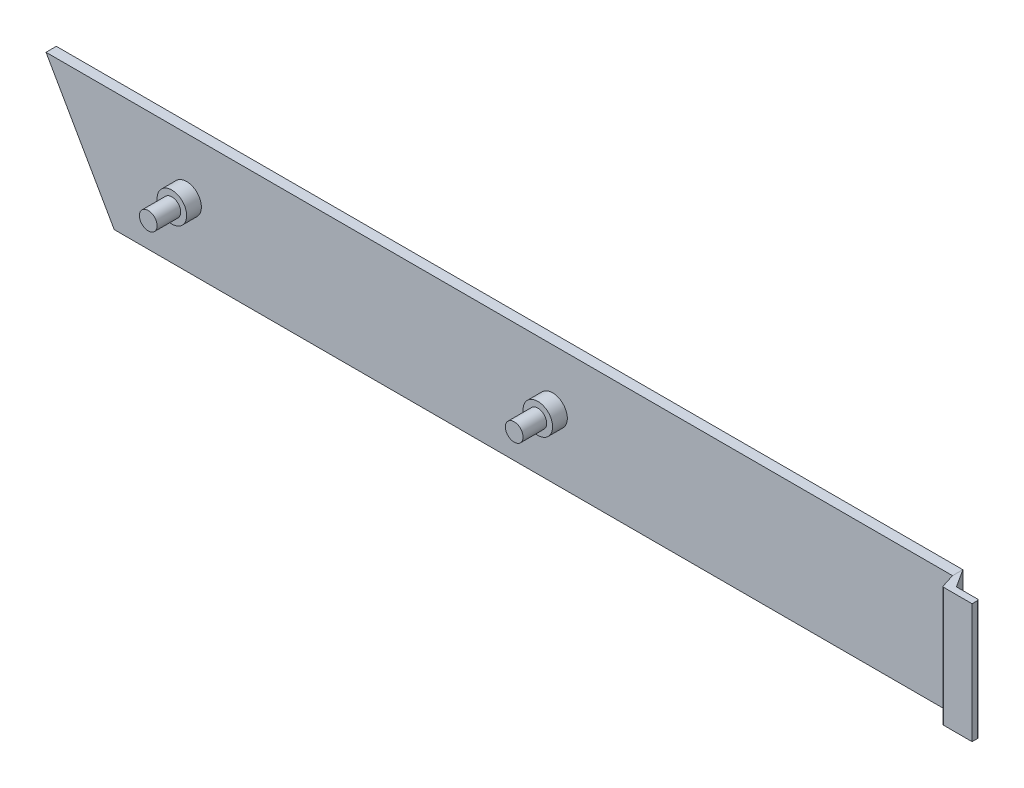
ISO-10303-21;
HEADER;
FILE_DESCRIPTION(('STEP AP214'),'2;1');
FILE_NAME('part.step','',(''),(''),'','','');
FILE_SCHEMA(('AUTOMOTIVE_DESIGN { 1 0 10303 214 1 1 1 1 }'));
ENDSEC;
DATA;
#1=APPLICATION_CONTEXT('core data for automotive mechanical design processes');
#2=APPLICATION_PROTOCOL_DEFINITION('international standard','automotive_design',2000,#1);
#3=PRODUCT_CONTEXT('',#1,'mechanical');
#4=PRODUCT('Part','Part','',(#3));
#5=PRODUCT_RELATED_PRODUCT_CATEGORY('part','',(#4));
#6=PRODUCT_DEFINITION_FORMATION('','',#4);
#7=PRODUCT_DEFINITION_CONTEXT('part definition',#1,'design');
#8=PRODUCT_DEFINITION('design','',#6,#7);
#9=PRODUCT_DEFINITION_SHAPE('','',#8);
#10=(LENGTH_UNIT() NAMED_UNIT(*) SI_UNIT(.MILLI.,.METRE.));
#11=(NAMED_UNIT(*) PLANE_ANGLE_UNIT() SI_UNIT($,.RADIAN.));
#12=(NAMED_UNIT(*) SI_UNIT($,.STERADIAN.) SOLID_ANGLE_UNIT());
#13=UNCERTAINTY_MEASURE_WITH_UNIT(LENGTH_MEASURE(1.E-05),#10,'distance_accuracy_value','');
#14=(GEOMETRIC_REPRESENTATION_CONTEXT(3) GLOBAL_UNCERTAINTY_ASSIGNED_CONTEXT((#13)) GLOBAL_UNIT_ASSIGNED_CONTEXT((#10,
#11,#12)) REPRESENTATION_CONTEXT('',''));
#15=CARTESIAN_POINT('',(0.,0.,0.));
#16=DIRECTION('',(0.,0.,1.));
#17=DIRECTION('',(1.,0.,0.));
#18=AXIS2_PLACEMENT_3D('',#15,#16,#17);
#19=CARTESIAN_POINT('',(0.,0.,0.));
#20=DIRECTION('',(0.,1.,0.));
#21=DIRECTION('',(0.,0.,1.));
#22=AXIS2_PLACEMENT_3D('',#19,#20,#21);
#23=PLANE('',#22);
#24=DIRECTION('',(-1.,0.,0.));
#25=VECTOR('',#24,1.);
#26=CARTESIAN_POINT('',(147.04430838964,0.,6.12592708642393));
#27=LINE('',#26,#25);
#28=CARTESIAN_POINT('',(146.54430838964,0.,6.12592708642393));
#29=VERTEX_POINT('',#28);
#30=CARTESIAN_POINT('',(139.715688943178,0.,6.12592708642393));
#31=VERTEX_POINT('',#30);
#32=EDGE_CURVE('E159',#29,#31,#27,.T.);
#33=ORIENTED_EDGE('',*,*,#32,.F.);
#34=CARTESIAN_POINT('',(146.54430838964,0.,6.62592708642393));
#35=DIRECTION('',(0.,1.,0.));
#36=DIRECTION('',(0.,0.,1.));
#37=AXIS2_PLACEMENT_3D('',#34,#35,#36);
#38=CIRCLE('',#37,0.5);
#39=CARTESIAN_POINT('',(147.04430838964,0.,6.62592708642393));
#40=VERTEX_POINT('',#39);
#41=EDGE_CURVE('E175',#29,#40,#38,.F.);
#42=ORIENTED_EDGE('',*,*,#41,.T.);
#43=DIRECTION('',(0.,0.,-1.));
#44=VECTOR('',#43,1.);
#45=CARTESIAN_POINT('',(147.04430838964,0.,8.42851835154063));
#46=LINE('',#45,#44);
#47=CARTESIAN_POINT('',(147.04430838964,0.,8.42851835154063));
#48=VERTEX_POINT('',#47);
#49=EDGE_CURVE('E156',#48,#40,#46,.T.);
#50=ORIENTED_EDGE('',*,*,#49,.F.);
#51=DIRECTION('',(1.,0.,0.));
#52=VECTOR('',#51,1.);
#53=CARTESIAN_POINT('',(137.04430838964,0.,8.42851835154063));
#54=LINE('',#53,#52);
#55=CARTESIAN_POINT('',(137.411704059277,0.,8.42851835154063));
#56=VERTEX_POINT('',#55);
#57=EDGE_CURVE('E144',#56,#48,#54,.T.);
#58=ORIENTED_EDGE('',*,*,#57,.F.);
#59=CARTESIAN_POINT('',(137.411704059277,0.,7.92851835154063));
#60=DIRECTION('',(0.,1.,0.));
#61=DIRECTION('',(0.,0.,1.));
#62=AXIS2_PLACEMENT_3D('',#59,#60,#61);
#63=CIRCLE('',#62,0.5);
#64=CARTESIAN_POINT('',(136.934541515382,0.,8.07790344686134));
#65=VERTEX_POINT('',#64);
#66=EDGE_CURVE('E143',#56,#65,#63,.F.);
#67=ORIENTED_EDGE('',*,*,#66,.T.);
#68=DIRECTION('',(0.298770190641397,0.,0.954325087789325));
#69=VECTOR('',#68,1.);
#70=CARTESIAN_POINT('',(135.501339032227,0.,3.5));
#71=LINE('',#70,#69);
#72=CARTESIAN_POINT('',(135.501339032227,0.,3.5));
#73=VERTEX_POINT('',#72);
#74=EDGE_CURVE('E127',#73,#65,#71,.T.);
#75=ORIENTED_EDGE('',*,*,#74,.F.);
#76=DIRECTION('',(0.,0.,1.));
#77=VECTOR('',#76,1.);
#78=CARTESIAN_POINT('',(135.501339032227,0.,3.5));
#79=LINE('',#78,#77);
#80=CARTESIAN_POINT('',(135.501339032227,0.,0.));
#81=VERTEX_POINT('',#80);
#82=EDGE_CURVE('E141',#81,#73,#79,.T.);
#83=ORIENTED_EDGE('',*,*,#82,.F.);
#84=DIRECTION('',(-0.541088390934601,0.,-0.840965726528617));
#85=VECTOR('',#84,1.);
#86=CARTESIAN_POINT('',(135.501339032227,0.,0.));
#87=LINE('',#86,#85);
#88=CARTESIAN_POINT('',(139.295206079914,0.,5.89647128189124));
#89=VERTEX_POINT('',#88);
#90=EDGE_CURVE('E162',#89,#81,#87,.T.);
#91=ORIENTED_EDGE('',*,*,#90,.F.);
#92=CARTESIAN_POINT('',(139.715688943178,0.,5.62592708642393));
#93=DIRECTION('',(0.,1.,0.));
#94=DIRECTION('',(0.,0.,1.));
#95=AXIS2_PLACEMENT_3D('',#92,#93,#94);
#96=CIRCLE('',#95,0.5);
#97=EDGE_CURVE('E61',#89,#31,#96,.T.);
#98=ORIENTED_EDGE('',*,*,#97,.T.);
#99=EDGE_LOOP('',(#33,#42,#50,#58,#67,#75,#83,#91,#98));
#100=FACE_BOUND('',#99,.T.);
#101=ADVANCED_FACE('F53',(#100),#23,.F.);
#102=CARTESIAN_POINT('',(135.501339032227,54.7722137401885,0.));
#103=DIRECTION('',(-0.840965726528617,0.,0.541088390934601));
#104=DIRECTION('',(0.541088390934601,0.,0.840965726528617));
#105=AXIS2_PLACEMENT_3D('',#102,#103,#104);
#106=PLANE('',#105);
#107=DIRECTION('',(0.541088390934601,0.,0.840965726528617));
#108=VECTOR('',#107,1.);
#109=CARTESIAN_POINT('',(135.501339032227,40.4795560731052,0.));
#110=LINE('',#109,#108);
#111=CARTESIAN_POINT('',(135.501339032227,40.4795560731052,0.));
#112=VERTEX_POINT('',#111);
#113=CARTESIAN_POINT('',(139.295206079914,40.4795560731052,5.89647128189124));
#114=VERTEX_POINT('',#113);
#115=EDGE_CURVE('E134',#112,#114,#110,.T.);
#116=ORIENTED_EDGE('',*,*,#115,.T.);
#117=DIRECTION('',(0.,-1.,0.));
#118=VECTOR('',#117,1.);
#119=CARTESIAN_POINT('',(139.295206079914,0.,5.89647128189124));
#120=LINE('',#119,#118);
#121=EDGE_CURVE('E182',#114,#89,#120,.T.);
#122=ORIENTED_EDGE('',*,*,#121,.T.);
#123=ORIENTED_EDGE('',*,*,#90,.T.);
#124=DIRECTION('',(0.,-1.,0.));
#125=VECTOR('',#124,1.);
#126=CARTESIAN_POINT('',(135.501339032227,54.7722137401885,0.));
#127=LINE('',#126,#125);
#128=EDGE_CURVE('E149',#112,#81,#127,.T.);
#129=ORIENTED_EDGE('',*,*,#128,.F.);
#130=EDGE_LOOP('',(#116,#122,#123,#129));
#131=FACE_BOUND('',#130,.T.);
#132=ADVANCED_FACE('F198',(#131),#106,.F.);
#133=CARTESIAN_POINT('',(147.04430838964,54.7722137401885,6.12592708642393));
#134=DIRECTION('',(0.,0.,1.));
#135=DIRECTION('',(1.,0.,0.));
#136=AXIS2_PLACEMENT_3D('',#133,#134,#135);
#137=PLANE('',#136);
#138=DIRECTION('',(1.,0.,0.));
#139=VECTOR('',#138,1.);
#140=CARTESIAN_POINT('',(147.04430838964,40.4795560731052,6.12592708642393));
#141=LINE('',#140,#139);
#142=CARTESIAN_POINT('',(139.715688943178,40.4795560731052,6.12592708642393));
#143=VERTEX_POINT('',#142);
#144=CARTESIAN_POINT('',(146.54430838964,40.4795560731052,6.12592708642393));
#145=VERTEX_POINT('',#144);
#146=EDGE_CURVE('E168',#143,#145,#141,.T.);
#147=ORIENTED_EDGE('',*,*,#146,.T.);
#148=DIRECTION('',(0.,-1.,0.));
#149=VECTOR('',#148,1.);
#150=CARTESIAN_POINT('',(146.54430838964,54.7722137401885,6.12592708642393));
#151=LINE('',#150,#149);
#152=EDGE_CURVE('E171',#145,#29,#151,.T.);
#153=ORIENTED_EDGE('',*,*,#152,.T.);
#154=ORIENTED_EDGE('',*,*,#32,.T.);
#155=DIRECTION('',(0.,-1.,0.));
#156=VECTOR('',#155,1.);
#157=CARTESIAN_POINT('',(139.715688943178,40.4795560731052,6.12592708642393));
#158=LINE('',#157,#156);
#159=EDGE_CURVE('E169',#31,#143,#158,.F.);
#160=ORIENTED_EDGE('',*,*,#159,.T.);
#161=EDGE_LOOP('',(#147,#153,#154,#160));
#162=FACE_BOUND('',#161,.T.);
#163=ADVANCED_FACE('F194',(#162),#137,.F.);
#164=CARTESIAN_POINT('',(147.04430838964,54.7722137401885,8.42851835154063));
#165=DIRECTION('',(-1.,0.,0.));
#166=DIRECTION('',(0.,0.,1.));
#167=AXIS2_PLACEMENT_3D('',#164,#165,#166);
#168=PLANE('',#167);
#169=ORIENTED_EDGE('',*,*,#49,.T.);
#170=DIRECTION('',(0.,-1.,0.));
#171=VECTOR('',#170,1.);
#172=CARTESIAN_POINT('',(147.04430838964,54.7722137401885,6.62592708642393));
#173=LINE('',#172,#171);
#174=CARTESIAN_POINT('',(147.04430838964,40.4795560731052,6.62592708642393));
#175=VERTEX_POINT('',#174);
#176=EDGE_CURVE('E177',#40,#175,#173,.F.);
#177=ORIENTED_EDGE('',*,*,#176,.T.);
#178=DIRECTION('',(0.,0.,1.));
#179=VECTOR('',#178,1.);
#180=CARTESIAN_POINT('',(147.04430838964,40.4795560731052,8.42851835154063));
#181=LINE('',#180,#179);
#182=CARTESIAN_POINT('',(147.04430838964,40.4795560731052,8.42851835154063));
#183=VERTEX_POINT('',#182);
#184=EDGE_CURVE('E202',#175,#183,#181,.T.);
#185=ORIENTED_EDGE('',*,*,#184,.T.);
#186=DIRECTION('',(0.,-1.,0.));
#187=VECTOR('',#186,1.);
#188=CARTESIAN_POINT('',(147.04430838964,54.7722137401885,8.42851835154063));
#189=LINE('',#188,#187);
#190=EDGE_CURVE('E135',#183,#48,#189,.T.);
#191=ORIENTED_EDGE('',*,*,#190,.T.);
#192=EDGE_LOOP('',(#169,#177,#185,#191));
#193=FACE_BOUND('',#192,.T.);
#194=ADVANCED_FACE('F212',(#193),#168,.F.);
#195=CARTESIAN_POINT('',(137.04430838964,54.7722137401885,8.42851835154063));
#196=DIRECTION('',(0.,0.,-1.));
#197=DIRECTION('',(-1.,0.,0.));
#198=AXIS2_PLACEMENT_3D('',#195,#196,#197);
#199=PLANE('',#198);
#200=DIRECTION('',(-1.,0.,0.));
#201=VECTOR('',#200,1.);
#202=CARTESIAN_POINT('',(137.04430838964,40.4795560731052,8.42851835154063));
#203=LINE('',#202,#201);
#204=CARTESIAN_POINT('',(137.411704059277,40.4795560731052,8.42851835154063));
#205=VERTEX_POINT('',#204);
#206=EDGE_CURVE('E201',#183,#205,#203,.T.);
#207=ORIENTED_EDGE('',*,*,#206,.T.);
#208=DIRECTION('',(0.,-1.,0.));
#209=VECTOR('',#208,1.);
#210=CARTESIAN_POINT('',(137.411704059277,54.7722137401885,8.42851835154063));
#211=LINE('',#210,#209);
#212=EDGE_CURVE('E185',#205,#56,#211,.T.);
#213=ORIENTED_EDGE('',*,*,#212,.T.);
#214=ORIENTED_EDGE('',*,*,#57,.T.);
#215=ORIENTED_EDGE('',*,*,#190,.F.);
#216=EDGE_LOOP('',(#207,#213,#214,#215));
#217=FACE_BOUND('',#216,.T.);
#218=ADVANCED_FACE('F215',(#217),#199,.F.);
#219=CARTESIAN_POINT('',(135.501339032227,54.7722137401885,3.5));
#220=DIRECTION('',(0.954325087789325,0.,-0.298770190641397));
#221=DIRECTION('',(-0.298770190641397,0.,-0.954325087789325));
#222=AXIS2_PLACEMENT_3D('',#219,#220,#221);
#223=PLANE('',#222);
#224=ORIENTED_EDGE('',*,*,#74,.T.);
#225=DIRECTION('',(0.,-1.,0.));
#226=VECTOR('',#225,1.);
#227=CARTESIAN_POINT('',(136.934541515382,54.7722137401885,8.07790344686133));
#228=LINE('',#227,#226);
#229=CARTESIAN_POINT('',(136.934541515382,40.4795560731052,8.07790344686134));
#230=VERTEX_POINT('',#229);
#231=EDGE_CURVE('E188',#65,#230,#228,.F.);
#232=ORIENTED_EDGE('',*,*,#231,.T.);
#233=DIRECTION('',(-0.298770190641397,0.,-0.954325087789325));
#234=VECTOR('',#233,1.);
#235=CARTESIAN_POINT('',(135.501339032227,40.4795560731052,3.5));
#236=LINE('',#235,#234);
#237=CARTESIAN_POINT('',(135.501339032227,40.4795560731052,3.5));
#238=VERTEX_POINT('',#237);
#239=EDGE_CURVE('E129',#230,#238,#236,.T.);
#240=ORIENTED_EDGE('',*,*,#239,.T.);
#241=DIRECTION('',(0.,-1.,0.));
#242=VECTOR('',#241,1.);
#243=CARTESIAN_POINT('',(135.501339032227,54.7722137401885,3.5));
#244=LINE('',#243,#242);
#245=EDGE_CURVE('E124',#238,#73,#244,.T.);
#246=ORIENTED_EDGE('',*,*,#245,.T.);
#247=EDGE_LOOP('',(#224,#232,#240,#246));
#248=FACE_BOUND('',#247,.T.);
#249=ADVANCED_FACE('F126',(#248),#223,.F.);
#250=CARTESIAN_POINT('',(135.501339032227,54.7722137401885,3.5));
#251=DIRECTION('',(1.,0.,0.));
#252=DIRECTION('',(0.,0.,-1.));
#253=AXIS2_PLACEMENT_3D('',#250,#251,#252);
#254=PLANE('',#253);
#255=ORIENTED_EDGE('',*,*,#245,.F.);
#256=DIRECTION('',(0.,0.,-1.));
#257=VECTOR('',#256,1.);
#258=CARTESIAN_POINT('',(135.501339032227,40.4795560731052,3.5));
#259=LINE('',#258,#257);
#260=EDGE_CURVE('E152',#238,#112,#259,.T.);
#261=ORIENTED_EDGE('',*,*,#260,.T.);
#262=ORIENTED_EDGE('',*,*,#128,.T.);
#263=ORIENTED_EDGE('',*,*,#82,.T.);
#264=EDGE_LOOP('',(#255,#261,#262,#263));
#265=FACE_BOUND('',#264,.T.);
#266=ADVANCED_FACE('F147',(#265),#254,.F.);
#267=CARTESIAN_POINT('',(-171.618506634796,40.4795560731052,3.5));
#268=DIRECTION('',(0.,-1.,0.));
#269=DIRECTION('',(0.,0.,-1.));
#270=AXIS2_PLACEMENT_3D('',#267,#268,#269);
#271=PLANE('',#270);
#272=ORIENTED_EDGE('',*,*,#184,.F.);
#273=CARTESIAN_POINT('',(146.54430838964,40.4795560731052,6.62592708642393));
#274=DIRECTION('',(0.,-1.,0.));
#275=DIRECTION('',(0.,0.,-1.));
#276=AXIS2_PLACEMENT_3D('',#273,#274,#275);
#277=CIRCLE('',#276,0.5);
#278=EDGE_CURVE('E180',#175,#145,#277,.F.);
#279=ORIENTED_EDGE('',*,*,#278,.T.);
#280=ORIENTED_EDGE('',*,*,#146,.F.);
#281=CARTESIAN_POINT('',(139.715688943178,40.4795560731052,5.62592708642393));
#282=DIRECTION('',(0.,-1.,0.));
#283=DIRECTION('',(0.,0.,-1.));
#284=AXIS2_PLACEMENT_3D('',#281,#282,#283);
#285=CIRCLE('',#284,0.5);
#286=EDGE_CURVE('E12',#143,#114,#285,.T.);
#287=ORIENTED_EDGE('',*,*,#286,.T.);
#288=ORIENTED_EDGE('',*,*,#115,.F.);
#289=ORIENTED_EDGE('',*,*,#260,.F.);
#290=ORIENTED_EDGE('',*,*,#239,.F.);
#291=CARTESIAN_POINT('',(137.411704059277,40.4795560731052,7.92851835154063));
#292=DIRECTION('',(0.,-1.,0.));
#293=DIRECTION('',(0.,0.,-1.));
#294=AXIS2_PLACEMENT_3D('',#291,#292,#293);
#295=CIRCLE('',#294,0.5);
#296=EDGE_CURVE('E73',#230,#205,#295,.F.);
#297=ORIENTED_EDGE('',*,*,#296,.T.);
#298=ORIENTED_EDGE('',*,*,#206,.F.);
#299=EDGE_LOOP('',(#272,#279,#280,#287,#288,#289,#290,#297,#298));
#300=FACE_BOUND('',#299,.T.);
#301=ADVANCED_FACE('F200',(#300),#271,.F.);
#302=CARTESIAN_POINT('',(146.54430838964,54.7722137401885,6.62592708642393));
#303=DIRECTION('',(0.,-1.,0.));
#304=DIRECTION('',(0.,0.,-1.));
#305=AXIS2_PLACEMENT_3D('',#302,#303,#304);
#306=CYLINDRICAL_SURFACE('',#305,0.5);
#307=ORIENTED_EDGE('',*,*,#278,.F.);
#308=ORIENTED_EDGE('',*,*,#176,.F.);
#309=ORIENTED_EDGE('',*,*,#41,.F.);
#310=ORIENTED_EDGE('',*,*,#152,.F.);
#311=EDGE_LOOP('',(#307,#308,#309,#310));
#312=FACE_BOUND('',#311,.T.);
#313=ADVANCED_FACE('F208',(#312),#306,.T.);
#314=CARTESIAN_POINT('',(139.715688943178,54.7722137401885,5.62592708642393));
#315=DIRECTION('',(0.,1.,0.));
#316=DIRECTION('',(0.,0.,1.));
#317=AXIS2_PLACEMENT_3D('',#314,#315,#316);
#318=CYLINDRICAL_SURFACE('',#317,0.5);
#319=ORIENTED_EDGE('',*,*,#286,.F.);
#320=ORIENTED_EDGE('',*,*,#159,.F.);
#321=ORIENTED_EDGE('',*,*,#97,.F.);
#322=ORIENTED_EDGE('',*,*,#121,.F.);
#323=EDGE_LOOP('',(#319,#320,#321,#322));
#324=FACE_BOUND('',#323,.T.);
#325=ADVANCED_FACE('F196',(#324),#318,.F.);
#326=CARTESIAN_POINT('',(137.411704059277,54.7722137401885,7.92851835154063));
#327=DIRECTION('',(0.,-1.,0.));
#328=DIRECTION('',(0.,0.,-1.));
#329=AXIS2_PLACEMENT_3D('',#326,#327,#328);
#330=CYLINDRICAL_SURFACE('',#329,0.5);
#331=ORIENTED_EDGE('',*,*,#296,.F.);
#332=ORIENTED_EDGE('',*,*,#231,.F.);
#333=ORIENTED_EDGE('',*,*,#66,.F.);
#334=ORIENTED_EDGE('',*,*,#212,.F.);
#335=EDGE_LOOP('',(#331,#332,#333,#334));
#336=FACE_BOUND('',#335,.T.);
#337=ADVANCED_FACE('F55',(#336),#330,.T.);
#338=CLOSED_SHELL('',(#101,#132,#163,#194,#218,#249,#266,#301,#313,#325,#337));
#339=MANIFOLD_SOLID_BREP('B2',#338);
#340=CARTESIAN_POINT('',(-148.498660967773,0.,3.5));
#341=DIRECTION('',(0.868347812292686,0.495955720691379,0.));
#342=DIRECTION('',(-0.49595572069138,0.868347812292686,0.));
#343=AXIS2_PLACEMENT_3D('',#340,#341,#342);
#344=PLANE('',#343);
#345=DIRECTION('',(0.49595572069138,-0.868347812292686,0.));
#346=VECTOR('',#345,1.);
#347=CARTESIAN_POINT('',(-148.498660967773,0.,0.));
#348=LINE('',#347,#346);
#349=CARTESIAN_POINT('',(-171.618506634796,40.4795560731052,0.));
#350=VERTEX_POINT('',#349);
#351=CARTESIAN_POINT('',(-148.498660967773,0.,0.));
#352=VERTEX_POINT('',#351);
#353=EDGE_CURVE('E403',#350,#352,#348,.T.);
#354=ORIENTED_EDGE('',*,*,#353,.T.);
#355=DIRECTION('',(0.,0.,-1.));
#356=VECTOR('',#355,1.);
#357=CARTESIAN_POINT('',(-148.498660967773,0.,3.5));
#358=LINE('',#357,#356);
#359=CARTESIAN_POINT('',(-148.498660967773,0.,3.5));
#360=VERTEX_POINT('',#359);
#361=EDGE_CURVE('E392',#360,#352,#358,.T.);
#362=ORIENTED_EDGE('',*,*,#361,.F.);
#363=DIRECTION('',(0.49595572069138,-0.868347812292686,0.));
#364=VECTOR('',#363,1.);
#365=CARTESIAN_POINT('',(-148.498660967773,0.,3.5));
#366=LINE('',#365,#364);
#367=CARTESIAN_POINT('',(-171.618506634796,40.4795560731052,3.5));
#368=VERTEX_POINT('',#367);
#369=EDGE_CURVE('E384',#368,#360,#366,.T.);
#370=ORIENTED_EDGE('',*,*,#369,.F.);
#371=DIRECTION('',(0.,0.,-1.));
#372=VECTOR('',#371,1.);
#373=CARTESIAN_POINT('',(-171.618506634796,40.4795560731052,3.5));
#374=LINE('',#373,#372);
#375=EDGE_CURVE('E399',#368,#350,#374,.T.);
#376=ORIENTED_EDGE('',*,*,#375,.T.);
#377=EDGE_LOOP('',(#354,#362,#370,#376));
#378=FACE_BOUND('',#377,.T.);
#379=ADVANCED_FACE('F329',(#378),#344,.F.);
#380=CARTESIAN_POINT('',(-148.498660967773,0.,3.5));
#381=DIRECTION('',(0.,1.,0.));
#382=DIRECTION('',(0.,0.,1.));
#383=AXIS2_PLACEMENT_3D('',#380,#381,#382);
#384=PLANE('',#383);
#385=DIRECTION('',(1.,0.,0.));
#386=VECTOR('',#385,1.);
#387=CARTESIAN_POINT('',(-148.498660967773,0.,0.));
#388=LINE('',#387,#386);
#389=CARTESIAN_POINT('',(135.501339032227,0.,0.));
#390=VERTEX_POINT('',#389);
#391=EDGE_CURVE('E390',#352,#390,#388,.T.);
#392=ORIENTED_EDGE('',*,*,#391,.T.);
#393=DIRECTION('',(0.,0.,-1.));
#394=VECTOR('',#393,1.);
#395=CARTESIAN_POINT('',(135.501339032227,0.,3.5));
#396=LINE('',#395,#394);
#397=CARTESIAN_POINT('',(135.501339032227,0.,3.5));
#398=VERTEX_POINT('',#397);
#399=EDGE_CURVE('E388',#398,#390,#396,.T.);
#400=ORIENTED_EDGE('',*,*,#399,.F.);
#401=DIRECTION('',(1.,0.,0.));
#402=VECTOR('',#401,1.);
#403=CARTESIAN_POINT('',(-148.498660967773,0.,3.5));
#404=LINE('',#403,#402);
#405=EDGE_CURVE('E379',#360,#398,#404,.T.);
#406=ORIENTED_EDGE('',*,*,#405,.F.);
#407=ORIENTED_EDGE('',*,*,#361,.T.);
#408=EDGE_LOOP('',(#392,#400,#406,#407));
#409=FACE_BOUND('',#408,.T.);
#410=ADVANCED_FACE('F389',(#409),#384,.F.);
#411=CARTESIAN_POINT('',(135.501339032227,40.4795560731052,3.5));
#412=DIRECTION('',(-1.,0.,0.));
#413=DIRECTION('',(0.,0.,1.));
#414=AXIS2_PLACEMENT_3D('',#411,#412,#413);
#415=PLANE('',#414);
#416=DIRECTION('',(0.,1.,0.));
#417=VECTOR('',#416,1.);
#418=CARTESIAN_POINT('',(135.501339032227,40.4795560731052,0.));
#419=LINE('',#418,#417);
#420=CARTESIAN_POINT('',(135.501339032227,40.4795560731052,0.));
#421=VERTEX_POINT('',#420);
#422=EDGE_CURVE('E365',#390,#421,#419,.T.);
#423=ORIENTED_EDGE('',*,*,#422,.T.);
#424=DIRECTION('',(0.,0.,-1.));
#425=VECTOR('',#424,1.);
#426=CARTESIAN_POINT('',(135.501339032227,40.4795560731052,3.5));
#427=LINE('',#426,#425);
#428=CARTESIAN_POINT('',(135.501339032227,40.4795560731052,3.5));
#429=VERTEX_POINT('',#428);
#430=EDGE_CURVE('E393',#429,#421,#427,.T.);
#431=ORIENTED_EDGE('',*,*,#430,.F.);
#432=DIRECTION('',(0.,1.,0.));
#433=VECTOR('',#432,1.);
#434=CARTESIAN_POINT('',(135.501339032227,40.4795560731052,3.5));
#435=LINE('',#434,#433);
#436=EDGE_CURVE('E382',#398,#429,#435,.T.);
#437=ORIENTED_EDGE('',*,*,#436,.F.);
#438=ORIENTED_EDGE('',*,*,#399,.T.);
#439=EDGE_LOOP('',(#423,#431,#437,#438));
#440=FACE_BOUND('',#439,.T.);
#441=ADVANCED_FACE('F395',(#440),#415,.F.);
#442=CARTESIAN_POINT('',(-171.618506634796,40.4795560731052,3.5));
#443=DIRECTION('',(0.,-1.,0.));
#444=DIRECTION('',(0.,0.,-1.));
#445=AXIS2_PLACEMENT_3D('',#442,#443,#444);
#446=PLANE('',#445);
#447=DIRECTION('',(-1.,0.,0.));
#448=VECTOR('',#447,1.);
#449=CARTESIAN_POINT('',(-171.618506634796,40.4795560731052,0.));
#450=LINE('',#449,#448);
#451=EDGE_CURVE('E371',#421,#350,#450,.T.);
#452=ORIENTED_EDGE('',*,*,#451,.T.);
#453=ORIENTED_EDGE('',*,*,#375,.F.);
#454=DIRECTION('',(-1.,0.,0.));
#455=VECTOR('',#454,1.);
#456=CARTESIAN_POINT('',(-171.618506634796,40.4795560731052,3.5));
#457=LINE('',#456,#455);
#458=EDGE_CURVE('E348',#429,#368,#457,.T.);
#459=ORIENTED_EDGE('',*,*,#458,.F.);
#460=ORIENTED_EDGE('',*,*,#430,.T.);
#461=EDGE_LOOP('',(#452,#453,#459,#460));
#462=FACE_BOUND('',#461,.T.);
#463=ADVANCED_FACE('F494',(#462),#446,.F.);
#464=CARTESIAN_POINT('',(0.,0.,3.5));
#465=DIRECTION('',(0.,0.,-1.));
#466=DIRECTION('',(-1.,0.,0.));
#467=AXIS2_PLACEMENT_3D('',#464,#465,#466);
#468=PLANE('',#467);
#469=CARTESIAN_POINT('',(0.,21.3813945096677,3.5));
#470=DIRECTION('',(0.,0.,-1.));
#471=DIRECTION('',(-1.,0.,0.));
#472=AXIS2_PLACEMENT_3D('',#469,#470,#471);
#473=CIRCLE('',#472,5.);
#474=CARTESIAN_POINT('',(-5.,21.3813945096677,3.5));
#475=VERTEX_POINT('',#474);
#476=EDGE_CURVE('E332',#475,#475,#473,.F.);
#477=ORIENTED_EDGE('',*,*,#476,.F.);
#478=EDGE_LOOP('',(#477));
#479=FACE_BOUND('',#478,.T.);
#480=CARTESIAN_POINT('',(-123.979089883189,21.3813945096677,3.5));
#481=DIRECTION('',(0.,0.,-1.));
#482=DIRECTION('',(-1.,0.,0.));
#483=AXIS2_PLACEMENT_3D('',#480,#481,#482);
#484=CIRCLE('',#483,5.);
#485=CARTESIAN_POINT('',(-128.979089883189,21.3813945096677,3.5));
#486=VERTEX_POINT('',#485);
#487=EDGE_CURVE('E419',#486,#486,#484,.F.);
#488=ORIENTED_EDGE('',*,*,#487,.F.);
#489=EDGE_LOOP('',(#488));
#490=FACE_BOUND('',#489,.T.);
#491=ORIENTED_EDGE('',*,*,#369,.T.);
#492=ORIENTED_EDGE('',*,*,#405,.T.);
#493=ORIENTED_EDGE('',*,*,#436,.T.);
#494=ORIENTED_EDGE('',*,*,#458,.T.);
#495=EDGE_LOOP('',(#491,#492,#493,#494));
#496=FACE_BOUND('',#495,.T.);
#497=ADVANCED_FACE('F380',(#479,#490,#496),#468,.F.);
#498=CARTESIAN_POINT('',(0.,0.,0.));
#499=DIRECTION('',(0.,0.,-1.));
#500=DIRECTION('',(-1.,0.,0.));
#501=AXIS2_PLACEMENT_3D('',#498,#499,#500);
#502=PLANE('',#501);
#503=ORIENTED_EDGE('',*,*,#353,.F.);
#504=ORIENTED_EDGE('',*,*,#451,.F.);
#505=ORIENTED_EDGE('',*,*,#422,.F.);
#506=ORIENTED_EDGE('',*,*,#391,.F.);
#507=EDGE_LOOP('',(#503,#504,#505,#506));
#508=FACE_BOUND('',#507,.T.);
#509=ADVANCED_FACE('F485',(#508),#502,.T.);
#510=CARTESIAN_POINT('',(-123.979089883189,21.3813945096677,8.5));
#511=DIRECTION('',(0.,0.,-1.));
#512=DIRECTION('',(-1.,0.,0.));
#513=AXIS2_PLACEMENT_3D('',#510,#511,#512);
#514=CYLINDRICAL_SURFACE('',#513,5.);
#515=CARTESIAN_POINT('',(-123.979089883189,21.3813945096677,8.5));
#516=DIRECTION('',(0.,0.,1.));
#517=DIRECTION('',(1.,0.,0.));
#518=AXIS2_PLACEMENT_3D('',#515,#516,#517);
#519=CIRCLE('',#518,5.);
#520=CARTESIAN_POINT('',(-118.979089883189,21.3813945096677,8.5));
#521=VERTEX_POINT('',#520);
#522=EDGE_CURVE('E407',#521,#521,#519,.T.);
#523=ORIENTED_EDGE('',*,*,#522,.F.);
#524=EDGE_LOOP('',(#523));
#525=FACE_BOUND('',#524,.T.);
#526=ORIENTED_EDGE('',*,*,#487,.T.);
#527=EDGE_LOOP('',(#526));
#528=FACE_BOUND('',#527,.T.);
#529=ADVANCED_FACE('F474',(#525,#528),#514,.T.);
#530=CARTESIAN_POINT('',(-123.979089883189,21.3813945096677,8.5));
#531=DIRECTION('',(0.,0.,1.));
#532=DIRECTION('',(1.,0.,0.));
#533=AXIS2_PLACEMENT_3D('',#530,#531,#532);
#534=PLANE('',#533);
#535=CARTESIAN_POINT('',(-123.979089883189,21.3813945096677,8.5));
#536=DIRECTION('',(0.,0.,1.));
#537=DIRECTION('',(1.,0.,0.));
#538=AXIS2_PLACEMENT_3D('',#535,#536,#537);
#539=CIRCLE('',#538,3.00000000000001);
#540=CARTESIAN_POINT('',(-120.979089883189,21.3813945096677,8.5));
#541=VERTEX_POINT('',#540);
#542=EDGE_CURVE('E339',#541,#541,#539,.T.);
#543=ORIENTED_EDGE('',*,*,#542,.F.);
#544=EDGE_LOOP('',(#543));
#545=FACE_BOUND('',#544,.T.);
#546=ORIENTED_EDGE('',*,*,#522,.T.);
#547=EDGE_LOOP('',(#546));
#548=FACE_BOUND('',#547,.T.);
#549=ADVANCED_FACE('F469',(#545,#548),#534,.T.);
#550=CARTESIAN_POINT('',(0.,21.3813945096677,8.5));
#551=DIRECTION('',(0.,0.,-1.));
#552=DIRECTION('',(-1.,0.,0.));
#553=AXIS2_PLACEMENT_3D('',#550,#551,#552);
#554=CYLINDRICAL_SURFACE('',#553,5.);
#555=CARTESIAN_POINT('',(0.,21.3813945096677,8.5));
#556=DIRECTION('',(0.,0.,1.));
#557=DIRECTION('',(1.,0.,0.));
#558=AXIS2_PLACEMENT_3D('',#555,#556,#557);
#559=CIRCLE('',#558,5.);
#560=CARTESIAN_POINT('',(5.,21.3813945096677,8.5));
#561=VERTEX_POINT('',#560);
#562=EDGE_CURVE('E437',#561,#561,#559,.T.);
#563=ORIENTED_EDGE('',*,*,#562,.F.);
#564=EDGE_LOOP('',(#563));
#565=FACE_BOUND('',#564,.T.);
#566=ORIENTED_EDGE('',*,*,#476,.T.);
#567=EDGE_LOOP('',(#566));
#568=FACE_BOUND('',#567,.T.);
#569=ADVANCED_FACE('F464',(#565,#568),#554,.T.);
#570=CARTESIAN_POINT('',(0.,21.3813945096677,8.5));
#571=DIRECTION('',(0.,0.,1.));
#572=DIRECTION('',(1.,0.,0.));
#573=AXIS2_PLACEMENT_3D('',#570,#571,#572);
#574=PLANE('',#573);
#575=CARTESIAN_POINT('',(0.,21.3813945096677,8.5));
#576=DIRECTION('',(0.,0.,1.));
#577=DIRECTION('',(1.,0.,0.));
#578=AXIS2_PLACEMENT_3D('',#575,#576,#577);
#579=CIRCLE('',#578,3.);
#580=CARTESIAN_POINT('',(3.,21.3813945096677,8.5));
#581=VERTEX_POINT('',#580);
#582=EDGE_CURVE('E51',#581,#581,#579,.T.);
#583=ORIENTED_EDGE('',*,*,#582,.F.);
#584=EDGE_LOOP('',(#583));
#585=FACE_BOUND('',#584,.T.);
#586=ORIENTED_EDGE('',*,*,#562,.T.);
#587=EDGE_LOOP('',(#586));
#588=FACE_BOUND('',#587,.T.);
#589=ADVANCED_FACE('F460',(#585,#588),#574,.T.);
#590=CARTESIAN_POINT('',(-123.979089883189,21.3813945096677,16.5));
#591=DIRECTION('',(0.,0.,-1.));
#592=DIRECTION('',(-1.,0.,0.));
#593=AXIS2_PLACEMENT_3D('',#590,#591,#592);
#594=CYLINDRICAL_SURFACE('',#593,3.00000000000001);
#595=CARTESIAN_POINT('',(-123.979089883189,21.3813945096677,16.5));
#596=DIRECTION('',(0.,0.,1.));
#597=DIRECTION('',(1.,0.,0.));
#598=AXIS2_PLACEMENT_3D('',#595,#596,#597);
#599=CIRCLE('',#598,3.00000000000001);
#600=CARTESIAN_POINT('',(-120.979089883189,21.3813945096677,16.5));
#601=VERTEX_POINT('',#600);
#602=EDGE_CURVE('E435',#601,#601,#599,.T.);
#603=ORIENTED_EDGE('',*,*,#602,.F.);
#604=EDGE_LOOP('',(#603));
#605=FACE_BOUND('',#604,.T.);
#606=ORIENTED_EDGE('',*,*,#542,.T.);
#607=EDGE_LOOP('',(#606));
#608=FACE_BOUND('',#607,.T.);
#609=ADVANCED_FACE('F463',(#605,#608),#594,.T.);
#610=CARTESIAN_POINT('',(-123.979089883189,21.3813945096677,16.5));
#611=DIRECTION('',(0.,0.,1.));
#612=DIRECTION('',(1.,0.,0.));
#613=AXIS2_PLACEMENT_3D('',#610,#611,#612);
#614=PLANE('',#613);
#615=ORIENTED_EDGE('',*,*,#602,.T.);
#616=EDGE_LOOP('',(#615));
#617=FACE_BOUND('',#616,.T.);
#618=ADVANCED_FACE('F456',(#617),#614,.T.);
#619=CARTESIAN_POINT('',(0.,21.3813945096677,16.5));
#620=DIRECTION('',(0.,0.,-1.));
#621=DIRECTION('',(-1.,0.,0.));
#622=AXIS2_PLACEMENT_3D('',#619,#620,#621);
#623=CYLINDRICAL_SURFACE('',#622,3.);
#624=CARTESIAN_POINT('',(0.,21.3813945096677,16.5));
#625=DIRECTION('',(0.,0.,1.));
#626=DIRECTION('',(1.,0.,0.));
#627=AXIS2_PLACEMENT_3D('',#624,#625,#626);
#628=CIRCLE('',#627,3.);
#629=CARTESIAN_POINT('',(3.,21.3813945096677,16.5));
#630=VERTEX_POINT('',#629);
#631=EDGE_CURVE('E447',#630,#630,#628,.T.);
#632=ORIENTED_EDGE('',*,*,#631,.F.);
#633=EDGE_LOOP('',(#632));
#634=FACE_BOUND('',#633,.T.);
#635=ORIENTED_EDGE('',*,*,#582,.T.);
#636=EDGE_LOOP('',(#635));
#637=FACE_BOUND('',#636,.T.);
#638=ADVANCED_FACE('F453',(#634,#637),#623,.T.);
#639=CARTESIAN_POINT('',(0.,21.3813945096677,16.5));
#640=DIRECTION('',(0.,0.,1.));
#641=DIRECTION('',(1.,0.,0.));
#642=AXIS2_PLACEMENT_3D('',#639,#640,#641);
#643=PLANE('',#642);
#644=ORIENTED_EDGE('',*,*,#631,.T.);
#645=EDGE_LOOP('',(#644));
#646=FACE_BOUND('',#645,.T.);
#647=ADVANCED_FACE('F451',(#646),#643,.T.);
#648=CLOSED_SHELL('',(#379,#410,#441,#463,#497,#509,#529,#549,#569,#589,#609,#618,#638,#647));
#649=MANIFOLD_SOLID_BREP('B6',#648);
#650=ADVANCED_BREP_SHAPE_REPRESENTATION('',(#18,#339,#649),#14);
#651=SHAPE_DEFINITION_REPRESENTATION(#9,#650);
ENDSEC;
END-ISO-10303-21;
